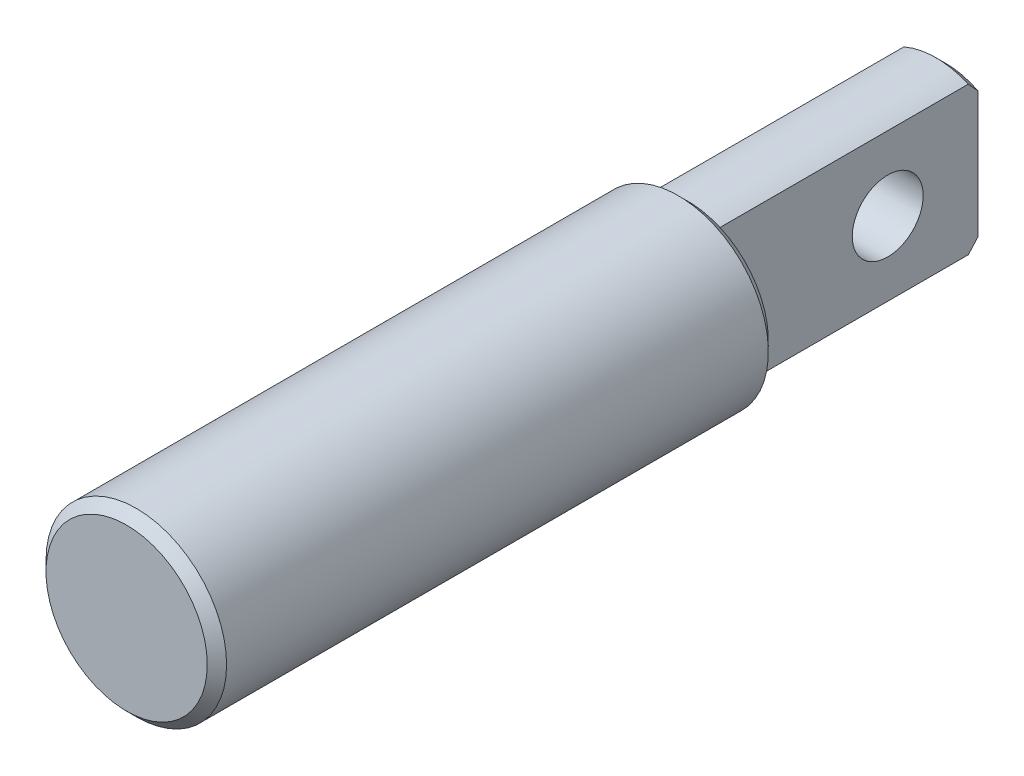
ISO-10303-21;
HEADER;
FILE_DESCRIPTION(('STEP AP214'),'2;1');
FILE_NAME('part.step','',(''),(''),'','','');
FILE_SCHEMA(('AUTOMOTIVE_DESIGN { 1 0 10303 214 1 1 1 1 }'));
ENDSEC;
DATA;
#1=APPLICATION_CONTEXT('core data for automotive mechanical design processes');
#2=APPLICATION_PROTOCOL_DEFINITION('international standard','automotive_design',2000,#1);
#3=PRODUCT_CONTEXT('',#1,'mechanical');
#4=PRODUCT('Part','Part','',(#3));
#5=PRODUCT_RELATED_PRODUCT_CATEGORY('part','',(#4));
#6=PRODUCT_DEFINITION_FORMATION('','',#4);
#7=PRODUCT_DEFINITION_CONTEXT('part definition',#1,'design');
#8=PRODUCT_DEFINITION('design','',#6,#7);
#9=PRODUCT_DEFINITION_SHAPE('','',#8);
#10=(LENGTH_UNIT() NAMED_UNIT(*) SI_UNIT(.MILLI.,.METRE.));
#11=(NAMED_UNIT(*) PLANE_ANGLE_UNIT() SI_UNIT($,.RADIAN.));
#12=(NAMED_UNIT(*) SI_UNIT($,.STERADIAN.) SOLID_ANGLE_UNIT());
#13=UNCERTAINTY_MEASURE_WITH_UNIT(LENGTH_MEASURE(1.E-05),#10,'distance_accuracy_value','');
#14=(GEOMETRIC_REPRESENTATION_CONTEXT(3) GLOBAL_UNCERTAINTY_ASSIGNED_CONTEXT((#13)) GLOBAL_UNIT_ASSIGNED_CONTEXT((#10,
#11,#12)) REPRESENTATION_CONTEXT('',''));
#15=CARTESIAN_POINT('',(0.,0.,0.));
#16=DIRECTION('',(0.,0.,1.));
#17=DIRECTION('',(1.,0.,0.));
#18=AXIS2_PLACEMENT_3D('',#15,#16,#17);
#19=CARTESIAN_POINT('',(0.,0.,40.));
#20=DIRECTION('',(0.,0.,-1.));
#21=DIRECTION('',(-1.,0.,0.));
#22=AXIS2_PLACEMENT_3D('',#19,#20,#21);
#23=PLANE('',#22);
#24=DIRECTION('',(0.,1.,0.));
#25=VECTOR('',#24,1.);
#26=CARTESIAN_POINT('',(5.,14.4188596491233,40.));
#27=LINE('',#26,#25);
#28=CARTESIAN_POINT('',(5.,-11.4564392373896,40.));
#29=VERTEX_POINT('',#28);
#30=CARTESIAN_POINT('',(5.,11.4564392373896,40.));
#31=VERTEX_POINT('',#30);
#32=EDGE_CURVE('E88',#29,#31,#27,.T.);
#33=ORIENTED_EDGE('',*,*,#32,.T.);
#34=CARTESIAN_POINT('',(0.,0.,40.));
#35=DIRECTION('',(0.,0.,-1.));
#36=DIRECTION('',(-1.,0.,0.));
#37=AXIS2_PLACEMENT_3D('',#34,#35,#36);
#38=CIRCLE('',#37,12.5);
#39=EDGE_CURVE('E41',#31,#29,#38,.T.);
#40=ORIENTED_EDGE('',*,*,#39,.T.);
#41=EDGE_LOOP('',(#33,#40));
#42=FACE_BOUND('',#41,.T.);
#43=ADVANCED_FACE('F33',(#42),#23,.T.);
#44=CARTESIAN_POINT('',(0.,0.,40.));
#45=DIRECTION('',(0.,0.,-1.));
#46=DIRECTION('',(-1.,0.,0.));
#47=AXIS2_PLACEMENT_3D('',#44,#45,#46);
#48=CYLINDRICAL_SURFACE('',#47,12.5);
#49=DIRECTION('',(0.,0.,-1.));
#50=VECTOR('',#49,1.);
#51=CARTESIAN_POINT('',(-5.,-11.4564392373896,40.));
#52=LINE('',#51,#50);
#53=CARTESIAN_POINT('',(-5.,-11.4564392373896,1.50000000000001));
#54=VERTEX_POINT('',#53);
#55=CARTESIAN_POINT('',(-5.,-11.4564392373896,40.));
#56=VERTEX_POINT('',#55);
#57=EDGE_CURVE('E114',#54,#56,#52,.F.);
#58=ORIENTED_EDGE('',*,*,#57,.F.);
#59=CARTESIAN_POINT('',(0.,0.,1.50000000000001));
#60=DIRECTION('',(0.,0.,1.));
#61=DIRECTION('',(1.,0.,0.));
#62=AXIS2_PLACEMENT_3D('',#59,#60,#61);
#63=CIRCLE('',#62,12.5);
#64=CARTESIAN_POINT('',(5.,-11.4564392373896,1.50000000000001));
#65=VERTEX_POINT('',#64);
#66=EDGE_CURVE('E111',#54,#65,#63,.T.);
#67=ORIENTED_EDGE('',*,*,#66,.T.);
#68=DIRECTION('',(0.,0.,-1.));
#69=VECTOR('',#68,1.);
#70=CARTESIAN_POINT('',(5.,-11.4564392373896,40.));
#71=LINE('',#70,#69);
#72=EDGE_CURVE('E100',#29,#65,#71,.T.);
#73=ORIENTED_EDGE('',*,*,#72,.F.);
#74=CARTESIAN_POINT('',(0.,0.,40.));
#75=DIRECTION('',(0.,0.,-1.));
#76=DIRECTION('',(-1.,0.,0.));
#77=AXIS2_PLACEMENT_3D('',#74,#75,#76);
#78=CIRCLE('',#77,12.5);
#79=EDGE_CURVE('E108',#29,#56,#78,.T.);
#80=ORIENTED_EDGE('',*,*,#79,.T.);
#81=EDGE_LOOP('',(#58,#67,#73,#80));
#82=FACE_BOUND('',#81,.T.);
#83=ADVANCED_FACE('F107',(#82),#48,.T.);
#84=CARTESIAN_POINT('',(0.,0.,127.));
#85=DIRECTION('',(0.,0.,-1.));
#86=DIRECTION('',(-1.,0.,0.));
#87=AXIS2_PLACEMENT_3D('',#84,#85,#86);
#88=CYLINDRICAL_SURFACE('',#87,14.);
#89=CARTESIAN_POINT('',(0.,0.,41.5));
#90=DIRECTION('',(0.,0.,-1.));
#91=DIRECTION('',(-1.,0.,0.));
#92=AXIS2_PLACEMENT_3D('',#89,#90,#91);
#93=CIRCLE('',#92,14.);
#94=CARTESIAN_POINT('',(-14.,0.,41.5));
#95=VERTEX_POINT('',#94);
#96=EDGE_CURVE('E12',#95,#95,#93,.F.);
#97=ORIENTED_EDGE('',*,*,#96,.T.);
#98=EDGE_LOOP('',(#97));
#99=FACE_BOUND('',#98,.T.);
#100=CARTESIAN_POINT('',(0.,0.,125.5));
#101=DIRECTION('',(0.,0.,1.));
#102=DIRECTION('',(1.,0.,0.));
#103=AXIS2_PLACEMENT_3D('',#100,#101,#102);
#104=CIRCLE('',#103,14.);
#105=CARTESIAN_POINT('',(14.,0.,125.5));
#106=VERTEX_POINT('',#105);
#107=EDGE_CURVE('E123',#106,#106,#104,.F.);
#108=ORIENTED_EDGE('',*,*,#107,.T.);
#109=EDGE_LOOP('',(#108));
#110=FACE_BOUND('',#109,.T.);
#111=ADVANCED_FACE('F191',(#99,#110),#88,.T.);
#112=CARTESIAN_POINT('',(0.,0.,127.));
#113=DIRECTION('',(0.,0.,1.));
#114=DIRECTION('',(1.,0.,0.));
#115=AXIS2_PLACEMENT_3D('',#112,#113,#114);
#116=PLANE('',#115);
#117=CARTESIAN_POINT('',(0.,0.,127.));
#118=DIRECTION('',(0.,0.,1.));
#119=DIRECTION('',(1.,0.,0.));
#120=AXIS2_PLACEMENT_3D('',#117,#118,#119);
#121=CIRCLE('',#120,12.5);
#122=CARTESIAN_POINT('',(12.5,0.,127.));
#123=VERTEX_POINT('',#122);
#124=EDGE_CURVE('E116',#123,#123,#121,.T.);
#125=ORIENTED_EDGE('',*,*,#124,.T.);
#126=EDGE_LOOP('',(#125));
#127=FACE_BOUND('',#126,.T.);
#128=ADVANCED_FACE('F189',(#127),#116,.T.);
#129=CARTESIAN_POINT('',(0.,0.,127.));
#130=DIRECTION('',(0.,0.,-1.));
#131=DIRECTION('',(-1.,0.,0.));
#132=AXIS2_PLACEMENT_3D('',#129,#130,#131);
#133=CONICAL_SURFACE('',#132,12.5,0.785398163397444);
#134=ORIENTED_EDGE('',*,*,#107,.F.);
#135=EDGE_LOOP('',(#134));
#136=FACE_BOUND('',#135,.T.);
#137=ORIENTED_EDGE('',*,*,#124,.F.);
#138=EDGE_LOOP('',(#137));
#139=FACE_BOUND('',#138,.T.);
#140=ADVANCED_FACE('F184',(#136,#139),#133,.T.);
#141=DIRECTION('',(0.,-1.,0.));
#142=VECTOR('',#141,1.);
#143=CARTESIAN_POINT('',(-5.,14.4188596491233,40.));
#144=LINE('',#143,#142);
#145=CARTESIAN_POINT('',(-5.,11.4564392373896,40.));
#146=VERTEX_POINT('',#145);
#147=EDGE_CURVE('E103',#146,#56,#144,.T.);
#148=ORIENTED_EDGE('',*,*,#147,.T.);
#149=CARTESIAN_POINT('',(0.,0.,40.));
#150=DIRECTION('',(0.,0.,-1.));
#151=DIRECTION('',(-1.,0.,0.));
#152=AXIS2_PLACEMENT_3D('',#149,#150,#151);
#153=CIRCLE('',#152,12.5);
#154=EDGE_CURVE('E94',#56,#146,#153,.T.);
#155=ORIENTED_EDGE('',*,*,#154,.T.);
#156=EDGE_LOOP('',(#148,#155));
#157=FACE_BOUND('',#156,.T.);
#158=ADVANCED_FACE('F188',(#157),#23,.T.);
#159=DIRECTION('',(0.,0.,-1.));
#160=VECTOR('',#159,1.);
#161=CARTESIAN_POINT('',(5.,11.4564392373896,40.));
#162=LINE('',#161,#160);
#163=CARTESIAN_POINT('',(5.,11.4564392373896,1.50000000000001));
#164=VERTEX_POINT('',#163);
#165=EDGE_CURVE('E102',#164,#31,#162,.F.);
#166=ORIENTED_EDGE('',*,*,#165,.F.);
#167=CARTESIAN_POINT('',(0.,0.,1.50000000000001));
#168=DIRECTION('',(0.,0.,1.));
#169=DIRECTION('',(1.,0.,0.));
#170=AXIS2_PLACEMENT_3D('',#167,#168,#169);
#171=CIRCLE('',#170,12.5);
#172=CARTESIAN_POINT('',(-5.,11.4564392373896,1.50000000000001));
#173=VERTEX_POINT('',#172);
#174=EDGE_CURVE('E56',#164,#173,#171,.T.);
#175=ORIENTED_EDGE('',*,*,#174,.T.);
#176=DIRECTION('',(0.,0.,-1.));
#177=VECTOR('',#176,1.);
#178=CARTESIAN_POINT('',(-5.,11.4564392373896,40.));
#179=LINE('',#178,#177);
#180=EDGE_CURVE('E117',#146,#173,#179,.T.);
#181=ORIENTED_EDGE('',*,*,#180,.F.);
#182=EDGE_CURVE('E113',#146,#31,#78,.T.);
#183=ORIENTED_EDGE('',*,*,#182,.T.);
#184=EDGE_LOOP('',(#166,#175,#181,#183));
#185=FACE_BOUND('',#184,.T.);
#186=ADVANCED_FACE('F166',(#185),#48,.T.);
#187=CARTESIAN_POINT('',(0.,0.,0.));
#188=DIRECTION('',(0.,0.,1.));
#189=DIRECTION('',(1.,0.,0.));
#190=AXIS2_PLACEMENT_3D('',#187,#188,#189);
#191=PLANE('',#190);
#192=DIRECTION('',(0.,1.,0.));
#193=VECTOR('',#192,1.);
#194=CARTESIAN_POINT('',(-5.,0.,0.));
#195=LINE('',#194,#193);
#196=CARTESIAN_POINT('',(-5.,-9.79795897113272,0.));
#197=VERTEX_POINT('',#196);
#198=CARTESIAN_POINT('',(-5.,9.79795897113272,0.));
#199=VERTEX_POINT('',#198);
#200=EDGE_CURVE('E129',#197,#199,#195,.T.);
#201=ORIENTED_EDGE('',*,*,#200,.T.);
#202=CARTESIAN_POINT('',(0.,0.,0.));
#203=DIRECTION('',(0.,0.,1.));
#204=DIRECTION('',(1.,0.,0.));
#205=AXIS2_PLACEMENT_3D('',#202,#203,#204);
#206=CIRCLE('',#205,11.);
#207=CARTESIAN_POINT('',(5.,9.79795897113272,0.));
#208=VERTEX_POINT('',#207);
#209=EDGE_CURVE('E135',#199,#208,#206,.F.);
#210=ORIENTED_EDGE('',*,*,#209,.T.);
#211=DIRECTION('',(0.,-1.,0.));
#212=VECTOR('',#211,1.);
#213=CARTESIAN_POINT('',(5.,0.,0.));
#214=LINE('',#213,#212);
#215=CARTESIAN_POINT('',(5.,-9.79795897113272,0.));
#216=VERTEX_POINT('',#215);
#217=EDGE_CURVE('E126',#208,#216,#214,.T.);
#218=ORIENTED_EDGE('',*,*,#217,.T.);
#219=CARTESIAN_POINT('',(0.,0.,0.));
#220=DIRECTION('',(0.,0.,1.));
#221=DIRECTION('',(1.,0.,0.));
#222=AXIS2_PLACEMENT_3D('',#219,#220,#221);
#223=CIRCLE('',#222,11.);
#224=EDGE_CURVE('E132',#216,#197,#223,.F.);
#225=ORIENTED_EDGE('',*,*,#224,.T.);
#226=EDGE_LOOP('',(#201,#210,#218,#225));
#227=FACE_BOUND('',#226,.T.);
#228=ADVANCED_FACE('F157',(#227),#191,.F.);
#229=CARTESIAN_POINT('',(5.,14.4188596491233,40.));
#230=DIRECTION('',(-1.,0.,0.));
#231=DIRECTION('',(0.,-1.,0.));
#232=AXIS2_PLACEMENT_3D('',#229,#230,#231);
#233=PLANE('',#232);
#234=CARTESIAN_POINT('',(5.,-3.95637879583498E-13,13.9999999999997));
#235=DIRECTION('',(-1.,0.,0.));
#236=DIRECTION('',(0.,-1.,0.));
#237=AXIS2_PLACEMENT_3D('',#234,#235,#236);
#238=CIRCLE('',#237,5.5);
#239=CARTESIAN_POINT('',(5.,-5.5000000000004,13.9999999999997));
#240=VERTEX_POINT('',#239);
#241=EDGE_CURVE('E306',#240,#240,#238,.T.);
#242=ORIENTED_EDGE('',*,*,#241,.T.);
#243=EDGE_LOOP('',(#242));
#244=FACE_BOUND('',#243,.T.);
#245=ORIENTED_EDGE('',*,*,#217,.F.);
#246=CARTESIAN_POINT('',(5.,9.79795897113272,0.));
#247=CARTESIAN_POINT('',(5.,9.93711241592854,0.123949896181917));
#248=CARTESIAN_POINT('',(5.,10.0759973024722,0.248200797231061));
#249=CARTESIAN_POINT('',(5.,10.3532775263691,0.497244241912361));
#250=CARTESIAN_POINT('',(5.,10.4916728698219,0.622036778752495));
#251=CARTESIAN_POINT('',(5.,10.7680247413865,0.872105949170463));
#252=CARTESIAN_POINT('',(5.,10.905981270485,0.99738258165845));
#253=CARTESIAN_POINT('',(5.,11.181497912407,1.24837450389847));
#254=CARTESIAN_POINT('',(5.,11.3190580202552,1.37408979911252));
#255=CARTESIAN_POINT('',(5.,11.4564392373896,1.50000000000001));
#256=B_SPLINE_CURVE_WITH_KNOTS('',3,(#246,#247,#248,#249,#250,#251,#252,#253,#254,#255),
.UNSPECIFIED.,.F.,.F.,(4,2,2,2,4),(0.,0.559056619993052,1.11810624964871,1.67715462144745,
2.23620997927497),.UNSPECIFIED.);
#257=EDGE_CURVE('E144',#208,#164,#256,.T.);
#258=ORIENTED_EDGE('',*,*,#257,.T.);
#259=ORIENTED_EDGE('',*,*,#165,.T.);
#260=ORIENTED_EDGE('',*,*,#32,.F.);
#261=ORIENTED_EDGE('',*,*,#72,.T.);
#262=CARTESIAN_POINT('',(5.,-11.4564392373896,1.50000000000001));
#263=CARTESIAN_POINT('',(5.,-11.3190580202552,1.37408979911252));
#264=CARTESIAN_POINT('',(5.,-11.181497912407,1.24837450389847));
#265=CARTESIAN_POINT('',(5.,-10.905981270485,0.997382581658449));
#266=CARTESIAN_POINT('',(5.,-10.7680247413865,0.872105949170462));
#267=CARTESIAN_POINT('',(5.,-10.4916728698219,0.622036778752496));
#268=CARTESIAN_POINT('',(5.,-10.3532775263691,0.497244241912362));
#269=CARTESIAN_POINT('',(5.,-10.0759973024722,0.248200797231062));
#270=CARTESIAN_POINT('',(5.,-9.93711241592854,0.123949896181918));
#271=CARTESIAN_POINT('',(5.,-9.79795897113273,0.));
#272=B_SPLINE_CURVE_WITH_KNOTS('',3,(#262,#263,#264,#265,#266,#267,#268,#269,#270,#271),
.UNSPECIFIED.,.F.,.F.,(4,2,2,2,4),(0.,0.559055357827522,1.11810372962625,1.67715335928192,
2.23620997927497),.UNSPECIFIED.);
#273=EDGE_CURVE('E138',#65,#216,#272,.T.);
#274=ORIENTED_EDGE('',*,*,#273,.T.);
#275=EDGE_LOOP('',(#245,#258,#259,#260,#261,#274));
#276=FACE_BOUND('',#275,.T.);
#277=ADVANCED_FACE('F99',(#244,#276),#233,.F.);
#278=CARTESIAN_POINT('',(-5.,14.4188596491233,40.));
#279=DIRECTION('',(1.,0.,0.));
#280=DIRECTION('',(0.,1.,0.));
#281=AXIS2_PLACEMENT_3D('',#278,#279,#280);
#282=PLANE('',#281);
#283=CARTESIAN_POINT('',(-5.,-3.9440669840833E-13,13.9999999999997));
#284=DIRECTION('',(-1.,0.,0.));
#285=DIRECTION('',(0.,-1.,0.));
#286=AXIS2_PLACEMENT_3D('',#283,#284,#285);
#287=CIRCLE('',#286,5.5);
#288=CARTESIAN_POINT('',(-5.,-5.5000000000004,13.9999999999997));
#289=VERTEX_POINT('',#288);
#290=EDGE_CURVE('E303',#289,#289,#287,.T.);
#291=ORIENTED_EDGE('',*,*,#290,.F.);
#292=EDGE_LOOP('',(#291));
#293=FACE_BOUND('',#292,.T.);
#294=ORIENTED_EDGE('',*,*,#180,.T.);
#295=CARTESIAN_POINT('',(-5.,11.4564392373896,1.50000000000001));
#296=CARTESIAN_POINT('',(-5.,11.3190580202552,1.37408979911252));
#297=CARTESIAN_POINT('',(-5.,11.181497912407,1.24837450389847));
#298=CARTESIAN_POINT('',(-5.,10.905981270485,0.997382581658451));
#299=CARTESIAN_POINT('',(-5.,10.7680247413865,0.872105949170463));
#300=CARTESIAN_POINT('',(-5.,10.4916728698219,0.622036778752495));
#301=CARTESIAN_POINT('',(-5.,10.3532775263691,0.497244241912361));
#302=CARTESIAN_POINT('',(-5.,10.0759973024722,0.248200797231061));
#303=CARTESIAN_POINT('',(-5.,9.93711241592854,0.123949896181916));
#304=CARTESIAN_POINT('',(-5.,9.79795897113272,0.));
#305=B_SPLINE_CURVE_WITH_KNOTS('',3,(#295,#296,#297,#298,#299,#300,#301,#302,#303,#304),
.UNSPECIFIED.,.F.,.F.,(4,2,2,2,4),(0.,0.559055357827522,1.11810372962626,1.67715335928192,
2.23620997927497),.UNSPECIFIED.);
#306=EDGE_CURVE('E174',#173,#199,#305,.T.);
#307=ORIENTED_EDGE('',*,*,#306,.T.);
#308=ORIENTED_EDGE('',*,*,#200,.F.);
#309=CARTESIAN_POINT('',(-5.,-9.79795897113272,0.));
#310=CARTESIAN_POINT('',(-5.,-9.93711241592854,0.123949896181916));
#311=CARTESIAN_POINT('',(-5.,-10.0759973024722,0.24820079723106));
#312=CARTESIAN_POINT('',(-5.,-10.3532775263691,0.49724424191236));
#313=CARTESIAN_POINT('',(-5.,-10.4916728698219,0.622036778752495));
#314=CARTESIAN_POINT('',(-5.,-10.7680247413865,0.872105949170462));
#315=CARTESIAN_POINT('',(-5.,-10.905981270485,0.997382581658449));
#316=CARTESIAN_POINT('',(-5.,-11.181497912407,1.24837450389847));
#317=CARTESIAN_POINT('',(-5.,-11.3190580202552,1.37408979911252));
#318=CARTESIAN_POINT('',(-5.,-11.4564392373896,1.50000000000001));
#319=B_SPLINE_CURVE_WITH_KNOTS('',3,(#309,#310,#311,#312,#313,#314,#315,#316,#317,#318),
.UNSPECIFIED.,.F.,.F.,(4,2,2,2,4),(0.,0.559056619993051,1.11810624964871,1.67715462144745,
2.23620997927497),.UNSPECIFIED.);
#320=EDGE_CURVE('E48',#197,#54,#319,.T.);
#321=ORIENTED_EDGE('',*,*,#320,.T.);
#322=ORIENTED_EDGE('',*,*,#57,.T.);
#323=ORIENTED_EDGE('',*,*,#147,.F.);
#324=EDGE_LOOP('',(#294,#307,#308,#321,#322,#323));
#325=FACE_BOUND('',#324,.T.);
#326=ADVANCED_FACE('F156',(#293,#325),#282,.F.);
#327=CARTESIAN_POINT('',(0.,0.,0.));
#328=DIRECTION('',(0.,0.,1.));
#329=DIRECTION('',(1.,0.,0.));
#330=AXIS2_PLACEMENT_3D('',#327,#328,#329);
#331=CONICAL_SURFACE('',#330,11.,0.785398163397443);
#332=ORIENTED_EDGE('',*,*,#306,.F.);
#333=ORIENTED_EDGE('',*,*,#174,.F.);
#334=ORIENTED_EDGE('',*,*,#257,.F.);
#335=ORIENTED_EDGE('',*,*,#209,.F.);
#336=EDGE_LOOP('',(#332,#333,#334,#335));
#337=FACE_BOUND('',#336,.T.);
#338=ADVANCED_FACE('F164',(#337),#331,.T.);
#339=CARTESIAN_POINT('',(0.,0.,0.));
#340=DIRECTION('',(0.,0.,1.));
#341=DIRECTION('',(1.,0.,0.));
#342=AXIS2_PLACEMENT_3D('',#339,#340,#341);
#343=CONICAL_SURFACE('',#342,11.,0.785398163397443);
#344=ORIENTED_EDGE('',*,*,#273,.F.);
#345=ORIENTED_EDGE('',*,*,#66,.F.);
#346=ORIENTED_EDGE('',*,*,#320,.F.);
#347=ORIENTED_EDGE('',*,*,#224,.F.);
#348=EDGE_LOOP('',(#344,#345,#346,#347));
#349=FACE_BOUND('',#348,.T.);
#350=ADVANCED_FACE('F150',(#349),#343,.T.);
#351=CARTESIAN_POINT('',(0.,0.,40.));
#352=DIRECTION('',(0.,0.,1.));
#353=DIRECTION('',(1.,0.,0.));
#354=AXIS2_PLACEMENT_3D('',#351,#352,#353);
#355=CONICAL_SURFACE('',#354,12.5,0.785398163397449);
#356=ORIENTED_EDGE('',*,*,#96,.F.);
#357=EDGE_LOOP('',(#356));
#358=FACE_BOUND('',#357,.T.);
#359=ORIENTED_EDGE('',*,*,#39,.F.);
#360=ORIENTED_EDGE('',*,*,#182,.F.);
#361=ORIENTED_EDGE('',*,*,#154,.F.);
#362=ORIENTED_EDGE('',*,*,#79,.F.);
#363=EDGE_LOOP('',(#359,#360,#361,#362));
#364=FACE_BOUND('',#363,.T.);
#365=ADVANCED_FACE('F35',(#358,#364),#355,.T.);
#366=CARTESIAN_POINT('',(18.,-3.97238415111217E-13,13.9999999999997));
#367=DIRECTION('',(-1.,0.,0.));
#368=DIRECTION('',(0.,-1.,0.));
#369=AXIS2_PLACEMENT_3D('',#366,#367,#368);
#370=CYLINDRICAL_SURFACE('',#369,5.5);
#371=ORIENTED_EDGE('',*,*,#290,.T.);
#372=EDGE_LOOP('',(#371));
#373=FACE_BOUND('',#372,.T.);
#374=ORIENTED_EDGE('',*,*,#241,.F.);
#375=EDGE_LOOP('',(#374));
#376=FACE_BOUND('',#375,.T.);
#377=ADVANCED_FACE('F159',(#373,#376),#370,.F.);
#378=CLOSED_SHELL('',(#43,#83,#111,#128,#140,#158,#186,#228,#277,#326,#338,#350,#365,#377));
#379=MANIFOLD_SOLID_BREP('B2',#378);
#380=ADVANCED_BREP_SHAPE_REPRESENTATION('',(#18,#379),#14);
#381=SHAPE_DEFINITION_REPRESENTATION(#9,#380);
ENDSEC;
END-ISO-10303-21;
